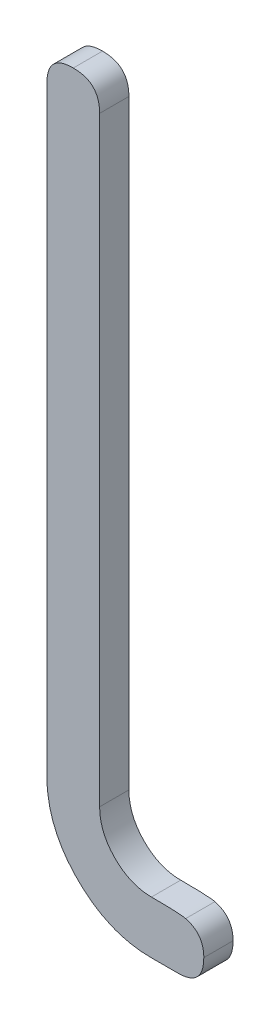
ISO-10303-21;
HEADER;
FILE_DESCRIPTION(('STEP AP214'),'2;1');
FILE_NAME('part.step','',(''),(''),'','','');
FILE_SCHEMA(('AUTOMOTIVE_DESIGN { 1 0 10303 214 1 1 1 1 }'));
ENDSEC;
DATA;
#1=APPLICATION_CONTEXT('core data for automotive mechanical design processes');
#2=APPLICATION_PROTOCOL_DEFINITION('international standard','automotive_design',2000,#1);
#3=PRODUCT_CONTEXT('',#1,'mechanical');
#4=PRODUCT('Part','Part','',(#3));
#5=PRODUCT_RELATED_PRODUCT_CATEGORY('part','',(#4));
#6=PRODUCT_DEFINITION_FORMATION('','',#4);
#7=PRODUCT_DEFINITION_CONTEXT('part definition',#1,'design');
#8=PRODUCT_DEFINITION('design','',#6,#7);
#9=PRODUCT_DEFINITION_SHAPE('','',#8);
#10=(LENGTH_UNIT() NAMED_UNIT(*) SI_UNIT(.MILLI.,.METRE.));
#11=(NAMED_UNIT(*) PLANE_ANGLE_UNIT() SI_UNIT($,.RADIAN.));
#12=(NAMED_UNIT(*) SI_UNIT($,.STERADIAN.) SOLID_ANGLE_UNIT());
#13=UNCERTAINTY_MEASURE_WITH_UNIT(LENGTH_MEASURE(1.E-05),#10,'distance_accuracy_value','');
#14=(GEOMETRIC_REPRESENTATION_CONTEXT(3) GLOBAL_UNCERTAINTY_ASSIGNED_CONTEXT((#13)) GLOBAL_UNIT_ASSIGNED_CONTEXT((#10,
#11,#12)) REPRESENTATION_CONTEXT('',''));
#15=CARTESIAN_POINT('',(0.,0.,0.));
#16=DIRECTION('',(0.,0.,1.));
#17=DIRECTION('',(1.,0.,0.));
#18=AXIS2_PLACEMENT_3D('',#15,#16,#17);
#19=CARTESIAN_POINT('',(0.,0.,1.6));
#20=DIRECTION('',(0.,0.,-1.));
#21=DIRECTION('',(-1.,0.,0.));
#22=AXIS2_PLACEMENT_3D('',#19,#20,#21);
#23=PLANE('',#22);
#24=CARTESIAN_POINT('',(-11.0218187525272,-21.8933047798276,1.6));
#25=CARTESIAN_POINT('',(-11.0134916629387,-21.8933089715033,1.6));
#26=CARTESIAN_POINT('',(-11.0051640767854,-21.8933350682191,1.6));
#27=CARTESIAN_POINT('',(-10.9884968199017,-21.8934723570355,1.6));
#28=CARTESIAN_POINT('',(-10.9801571503607,-21.893583680433,1.6));
#29=CARTESIAN_POINT('',(-10.9662367832498,-21.8938752206733,1.6));
#30=CARTESIAN_POINT('',(-10.9606553838701,-21.8940204983009,1.6));
#31=CARTESIAN_POINT('',(-10.9494994680288,-21.8943951007579,1.6));
#32=CARTESIAN_POINT('',(-10.9439249496041,-21.8946243594988,1.6));
#33=CARTESIAN_POINT('',(-10.9355558994583,-21.8950772269043,1.6));
#34=CARTESIAN_POINT('',(-10.9327585189369,-21.8952468660117,1.6));
#35=CARTESIAN_POINT('',(-10.9271687323597,-21.8956393631298,1.6));
#36=CARTESIAN_POINT('',(-10.9243763245615,-21.8958621955762,1.6));
#37=CARTESIAN_POINT('',(-10.918794114658,-21.8963926595871,1.6));
#38=CARTESIAN_POINT('',(-10.9160043256215,-21.896700438576,1.6));
#39=CARTESIAN_POINT('',(-10.9118333469898,-21.8972860466574,1.6));
#40=CARTESIAN_POINT('',(-10.9104442376156,-21.8975021207957,1.6));
#41=CARTESIAN_POINT('',(-10.9076802076166,-21.8980177596965,1.6));
#42=CARTESIAN_POINT('',(-10.9063053074125,-21.8983174308935,1.6));
#43=CARTESIAN_POINT('',(-10.9049437525278,-21.8986797798274,1.6));
#44=B_SPLINE_CURVE_WITH_KNOTS('',3,(#24,#25,#26,#27,#28,#29,#30,#31,#32,#33,#34,#35,#36,#37,#38,
#39,#40,#41,#42,#43),.UNSPECIFIED.,.F.,.F.,(4,2,2,2,2,2,2,2,2,4),(0.,0.0249820726483614,
0.0500027093461236,0.0667522610148793,0.0834886599236716,0.0918958797264656,0.100299067196362,
0.108716931073482,0.112932378121345,0.117153216906774),.UNSPECIFIED.);
#45=CARTESIAN_POINT('',(-11.0218187525272,-21.8933047798276,1.6));
#46=VERTEX_POINT('',#45);
#47=CARTESIAN_POINT('',(-10.9049437525272,-21.8986797798276,1.6));
#48=VERTEX_POINT('',#47);
#49=EDGE_CURVE('E102',#46,#48,#44,.T.);
#50=ORIENTED_EDGE('',*,*,#49,.T.);
#51=CARTESIAN_POINT('',(-10.9049437525272,-21.8986797798276,1.6));
#52=CARTESIAN_POINT('',(-10.8429437525272,-21.9149297798276,1.6));
#53=CARTESIAN_POINT('',(-10.8429437525272,-21.9833047798276,1.6));
#54=B_SPLINE_CURVE_WITH_KNOTS('',2,(#51,#52,#53),.UNSPECIFIED.,.F.,.F.,(3,3),(0.,1.),.UNSPECIFIED.);
#55=CARTESIAN_POINT('',(-10.8429437525272,-21.9833047798276,1.6));
#56=VERTEX_POINT('',#55);
#57=EDGE_CURVE('E98',#48,#56,#54,.T.);
#58=ORIENTED_EDGE('',*,*,#57,.T.);
#59=CARTESIAN_POINT('',(-10.8429437525272,-21.9833047798276,1.6));
#60=CARTESIAN_POINT('',(-10.8429437525272,-22.0733047798276,1.6));
#61=CARTESIAN_POINT('',(-10.9320062525272,-22.0733047798276,1.6));
#62=B_SPLINE_CURVE_WITH_KNOTS('',2,(#59,#60,#61),.UNSPECIFIED.,.F.,.F.,(3,3),(0.,1.),.UNSPECIFIED.);
#63=CARTESIAN_POINT('',(-10.9320062525272,-22.0733047798276,1.6));
#64=VERTEX_POINT('',#63);
#65=EDGE_CURVE('E99',#56,#64,#62,.T.);
#66=ORIENTED_EDGE('',*,*,#65,.T.);
#67=DIRECTION('',(1.,0.,0.));
#68=VECTOR('',#67,1.);
#69=CARTESIAN_POINT('',(-10.9320062525272,-22.0733047798276,1.6));
#70=LINE('',#69,#68);
#71=CARTESIAN_POINT('',(-11.0228187525272,-22.0733047798276,1.6));
#72=VERTEX_POINT('',#71);
#73=EDGE_CURVE('E105',#72,#64,#70,.T.);
#74=ORIENTED_EDGE('',*,*,#73,.F.);
#75=CARTESIAN_POINT('',(-11.0228187525272,-22.0733047798276,1.6));
#76=CARTESIAN_POINT('',(-11.0397038838066,-22.0733310046813,1.6));
#77=CARTESIAN_POINT('',(-11.056618079808,-22.0722495140739,1.6));
#78=CARTESIAN_POINT('',(-11.090077783474,-22.0677250657179,1.6));
#79=CARTESIAN_POINT('',(-11.1066241373851,-22.0642882719389,1.6));
#80=CARTESIAN_POINT('',(-11.1422858238821,-22.0539612335523,1.6));
#81=CARTESIAN_POINT('',(-11.1612446419249,-22.0465134809615,1.6));
#82=CARTESIAN_POINT('',(-11.1974799831229,-22.0282624769753,1.6));
#83=CARTESIAN_POINT('',(-11.2147546013965,-22.0174554827076,1.6));
#84=CARTESIAN_POINT('',(-11.2461059849784,-21.994000541288,1.6));
#85=CARTESIAN_POINT('',(-11.2603220745942,-21.9815349345195,1.6));
#86=CARTESIAN_POINT('',(-11.2869903288355,-21.9548380963451,1.6));
#87=CARTESIAN_POINT('',(-11.2994420190699,-21.9406063920136,1.6));
#88=CARTESIAN_POINT('',(-11.3241022626189,-21.9075810056475,1.6));
#89=CARTESIAN_POINT('',(-11.3358448913661,-21.8884296956071,1.6));
#90=CARTESIAN_POINT('',(-11.355202011143,-21.8481507712879,1.6));
#91=CARTESIAN_POINT('',(-11.3628213723873,-21.8270255232885,1.6));
#92=CARTESIAN_POINT('',(-11.3719241236683,-21.790822478177,1.6));
#93=CARTESIAN_POINT('',(-11.3745995028068,-21.7760278029041,1.6));
#94=CARTESIAN_POINT('',(-11.378115466613,-21.7462106474557,1.6));
#95=CARTESIAN_POINT('',(-11.3789550738891,-21.7311880502146,1.6));
#96=CARTESIAN_POINT('',(-11.3789437525272,-21.7161797798276,1.6));
#97=B_SPLINE_CURVE_WITH_KNOTS('',3,(#75,#76,#77,#78,#79,#80,#81,#82,#83,#84,#85,#86,#87,#88,#89,
#90,#91,#92,#93,#94,#95,#96),.UNSPECIFIED.,.F.,.F.,(4,2,2,2,2,2,2,2,2,2,4),(0.,
0.0506599501530436,0.101187823942333,0.16192589742171,0.222731889412438,0.279272049884424,
0.335827383489114,0.402784478388054,0.469662313052813,0.514656154349673,0.559673945191779),.UNSPECIFIED.);
#98=CARTESIAN_POINT('',(-11.3789437525272,-21.7161797798276,1.6));
#99=VERTEX_POINT('',#98);
#100=EDGE_CURVE('E151',#72,#99,#97,.T.);
#101=ORIENTED_EDGE('',*,*,#100,.T.);
#102=DIRECTION('',(0.,1.,0.));
#103=VECTOR('',#102,1.);
#104=CARTESIAN_POINT('',(-11.3789437525272,-21.7161797798276,1.6));
#105=LINE('',#104,#103);
#106=CARTESIAN_POINT('',(-11.3789437525272,-19.6626172798276,1.6));
#107=VERTEX_POINT('',#106);
#108=EDGE_CURVE('E188',#107,#99,#105,.F.);
#109=ORIENTED_EDGE('',*,*,#108,.F.);
#110=CARTESIAN_POINT('',(-11.3789437525272,-19.6626172798276,1.6));
#111=CARTESIAN_POINT('',(-11.3789437525272,-19.5733047798276,1.6));
#112=CARTESIAN_POINT('',(-11.2889437525272,-19.5733047798276,1.6));
#113=B_SPLINE_CURVE_WITH_KNOTS('',2,(#110,#111,#112),.UNSPECIFIED.,.F.,.F.,(3,3),(0.,1.),.UNSPECIFIED.);
#114=CARTESIAN_POINT('',(-11.2889437525272,-19.5733047798276,1.6));
#115=VERTEX_POINT('',#114);
#116=EDGE_CURVE('E121',#107,#115,#113,.T.);
#117=ORIENTED_EDGE('',*,*,#116,.T.);
#118=CARTESIAN_POINT('',(-11.2889437525272,-19.5733047798276,1.6));
#119=CARTESIAN_POINT('',(-11.1989437525272,-19.5733047798276,1.6));
#120=CARTESIAN_POINT('',(-11.1989437525272,-19.6625547798276,1.6));
#121=B_SPLINE_CURVE_WITH_KNOTS('',2,(#118,#119,#120),.UNSPECIFIED.,.F.,.F.,(3,3),(0.,1.),.UNSPECIFIED.);
#122=CARTESIAN_POINT('',(-11.1989437525272,-19.6625547798276,1.6));
#123=VERTEX_POINT('',#122);
#124=EDGE_CURVE('E145',#115,#123,#121,.T.);
#125=ORIENTED_EDGE('',*,*,#124,.T.);
#126=DIRECTION('',(0.,1.,0.));
#127=VECTOR('',#126,1.);
#128=CARTESIAN_POINT('',(-11.1989437525272,-19.6625547798276,1.6));
#129=LINE('',#128,#127);
#130=CARTESIAN_POINT('',(-11.1989437525272,-21.7148672798276,1.6));
#131=VERTEX_POINT('',#130);
#132=EDGE_CURVE('E119',#131,#123,#129,.T.);
#133=ORIENTED_EDGE('',*,*,#132,.F.);
#134=CARTESIAN_POINT('',(-11.1989437525272,-21.7148672798276,1.6));
#135=CARTESIAN_POINT('',(-11.1989561849476,-21.723306913579,1.6));
#136=CARTESIAN_POINT('',(-11.1984224311518,-21.7317607263809,1.6));
#137=CARTESIAN_POINT('',(-11.1961878310866,-21.7484891279083,1.6));
#138=CARTESIAN_POINT('',(-11.1944898486032,-21.756764105131,1.6));
#139=CARTESIAN_POINT('',(-11.189352248053,-21.7747201907046,1.6));
#140=CARTESIAN_POINT('',(-11.185615726148,-21.7843190930816,1.6));
#141=CARTESIAN_POINT('',(-11.1764348322275,-21.8026669524549,1.6));
#142=CARTESIAN_POINT('',(-11.1709884778523,-21.811414907374,1.6));
#143=CARTESIAN_POINT('',(-11.1591776849316,-21.8272583991285,1.6));
#144=CARTESIAN_POINT('',(-11.1529108905644,-21.8344282865127,1.6));
#145=CARTESIAN_POINT('',(-11.13947821179,-21.8478716039789,1.6));
#146=CARTESIAN_POINT('',(-11.1323121697682,-21.8541448764945,1.6));
#147=CARTESIAN_POINT('',(-11.1157523143725,-21.8664752272414,1.6));
#148=CARTESIAN_POINT('',(-11.1061873949236,-21.872308832898,1.6));
#149=CARTESIAN_POINT('',(-11.0860680710321,-21.8818892539377,1.6));
#150=CARTESIAN_POINT('',(-11.0755149314253,-21.8856386953423,1.6));
#151=CARTESIAN_POINT('',(-11.0576995249085,-21.8900073907248,1.6));
#152=CARTESIAN_POINT('',(-11.0505841602204,-21.8912636272819,1.6));
#153=CARTESIAN_POINT('',(-11.0362501745737,-21.8929148277432,1.6));
#154=CARTESIAN_POINT('',(-11.029031518826,-21.8933094942486,1.6));
#155=CARTESIAN_POINT('',(-11.0218187525272,-21.8933047798276,1.6));
#156=B_SPLINE_CURVE_WITH_KNOTS('',3,(#134,#135,#136,#137,#138,#139,#140,#141,#142,#143,#144,
#145,#146,#147,#148,#149,#150,#151,#152,#153,#154,#155),.UNSPECIFIED.,.F.,.F.,(4,2,2,2,2,2,2,2,
2,2,4),(0.,0.025321075577972,0.0505800884232037,0.0812933349865772,0.112042322452048,
0.140517994868707,0.168998665317513,0.202386385679847,0.235731942008133,0.257358314031647,
0.278992149920535),.UNSPECIFIED.);
#157=EDGE_CURVE('E23',#131,#46,#156,.T.);
#158=ORIENTED_EDGE('',*,*,#157,.T.);
#159=EDGE_LOOP('',(#50,#58,#66,#74,#101,#109,#117,#125,#133,#158));
#160=FACE_BOUND('',#159,.T.);
#161=ADVANCED_FACE('F17',(#160),#23,.T.);
#162=CARTESIAN_POINT('',(-10.9320062525272,-22.0733047798276,1.7));
#163=DIRECTION('',(0.,-1.,0.));
#164=DIRECTION('',(0.,0.,-1.));
#165=AXIS2_PLACEMENT_3D('',#162,#163,#164);
#166=PLANE('',#165);
#167=DIRECTION('',(-1.,0.,0.));
#168=VECTOR('',#167,1.);
#169=CARTESIAN_POINT('',(0.,-22.0733047798276,1.7));
#170=LINE('',#169,#168);
#171=CARTESIAN_POINT('',(-10.9320062525272,-22.0733047798276,1.7));
#172=VERTEX_POINT('',#171);
#173=CARTESIAN_POINT('',(-11.0228187525272,-22.0733047798276,1.7));
#174=VERTEX_POINT('',#173);
#175=EDGE_CURVE('E110',#172,#174,#170,.T.);
#176=ORIENTED_EDGE('',*,*,#175,.T.);
#177=DIRECTION('',(0.,0.,-1.));
#178=VECTOR('',#177,1.);
#179=CARTESIAN_POINT('',(-11.0228187525272,-22.0733047798276,1.65));
#180=LINE('',#179,#178);
#181=EDGE_CURVE('E262',#174,#72,#180,.T.);
#182=ORIENTED_EDGE('',*,*,#181,.T.);
#183=ORIENTED_EDGE('',*,*,#73,.T.);
#184=DIRECTION('',(0.,0.,1.));
#185=VECTOR('',#184,1.);
#186=CARTESIAN_POINT('',(-10.9320062525272,-22.0733047798276,1.65));
#187=LINE('',#186,#185);
#188=EDGE_CURVE('E111',#64,#172,#187,.T.);
#189=ORIENTED_EDGE('',*,*,#188,.T.);
#190=EDGE_LOOP('',(#176,#182,#183,#189));
#191=FACE_BOUND('',#190,.T.);
#192=ADVANCED_FACE('F133',(#191),#166,.T.);
#193=CARTESIAN_POINT('',(-11.0228187525272,-22.0733047798276,1.7));
#194=CARTESIAN_POINT('',(-11.1688187525272,-22.0733047798276,1.7));
#195=CARTESIAN_POINT('',(-11.3789437525272,-21.8626172798276,1.7));
#196=CARTESIAN_POINT('',(-11.3789437525272,-21.7161797798276,1.7));
#197=CARTESIAN_POINT('',(-11.0228187525272,-22.0733047798276,1.6));
#198=CARTESIAN_POINT('',(-11.1688187525272,-22.0733047798276,1.6));
#199=CARTESIAN_POINT('',(-11.3789437525272,-21.8626172798276,1.6));
#200=CARTESIAN_POINT('',(-11.3789437525272,-21.7161797798276,1.6));
#201=B_SPLINE_SURFACE_WITH_KNOTS('',1,2,((#193,#194,#195,#196),(#197,#198,#199,#200)),
.UNSPECIFIED.,.F.,.F.,.F.,(2,2),(3,1,3),(0.,1.),(0.,0.5,1.),.UNSPECIFIED.);
#202=CARTESIAN_POINT('',(-11.0228187525272,-22.0733047798276,1.7));
#203=CARTESIAN_POINT('',(-11.0397038838066,-22.0733310046813,1.7));
#204=CARTESIAN_POINT('',(-11.056618079808,-22.0722495140739,1.7));
#205=CARTESIAN_POINT('',(-11.090077783474,-22.0677250657179,1.7));
#206=CARTESIAN_POINT('',(-11.1066241373851,-22.0642882719389,1.7));
#207=CARTESIAN_POINT('',(-11.1422858238821,-22.0539612335523,1.7));
#208=CARTESIAN_POINT('',(-11.1612446419249,-22.0465134809615,1.7));
#209=CARTESIAN_POINT('',(-11.1974799831229,-22.0282624769753,1.7));
#210=CARTESIAN_POINT('',(-11.2147546013965,-22.0174554827076,1.7));
#211=CARTESIAN_POINT('',(-11.2461059849784,-21.994000541288,1.7));
#212=CARTESIAN_POINT('',(-11.2603220745942,-21.9815349345195,1.7));
#213=CARTESIAN_POINT('',(-11.2869903288355,-21.9548380963451,1.7));
#214=CARTESIAN_POINT('',(-11.2994420190699,-21.9406063920136,1.7));
#215=CARTESIAN_POINT('',(-11.3241022626189,-21.9075810056475,1.7));
#216=CARTESIAN_POINT('',(-11.3358448913661,-21.8884296956071,1.7));
#217=CARTESIAN_POINT('',(-11.355202011143,-21.8481507712879,1.7));
#218=CARTESIAN_POINT('',(-11.3628213723873,-21.8270255232885,1.7));
#219=CARTESIAN_POINT('',(-11.3719241236683,-21.790822478177,1.7));
#220=CARTESIAN_POINT('',(-11.3745995028068,-21.7760278029041,1.7));
#221=CARTESIAN_POINT('',(-11.378115466613,-21.7462106474557,1.7));
#222=CARTESIAN_POINT('',(-11.3789550738891,-21.7311880502146,1.7));
#223=CARTESIAN_POINT('',(-11.3789437525272,-21.7161797798276,1.7));
#224=B_SPLINE_CURVE_WITH_KNOTS('',3,(#202,#203,#204,#205,#206,#207,#208,#209,#210,#211,#212,
#213,#214,#215,#216,#217,#218,#219,#220,#221,#222,#223),.UNSPECIFIED.,.F.,.F.,(4,2,2,2,2,2,2,2,
2,2,4),(0.,0.0506599501530434,0.101187823942333,0.161925897421711,0.222731889412439,
0.279272049884425,0.335827383489115,0.402784478388055,0.469662313052814,0.514656154349673,
0.559673945191779),.UNSPECIFIED.);
#225=CARTESIAN_POINT('',(-11.3789437525272,-21.7161797798276,1.7));
#226=VERTEX_POINT('',#225);
#227=EDGE_CURVE('E236',#174,#226,#224,.T.);
#228=DIRECTION('',(0.,0.,1.));
#229=VECTOR('',#228,1.);
#230=CARTESIAN_POINT('',(-11.3789437525272,-21.7161797798276,1.7));
#231=LINE('',#230,#229);
#232=EDGE_CURVE('E260',#99,#226,#231,.T.);
#233=ORIENTED_EDGE('',*,*,#181,.F.);
#234=ORIENTED_EDGE('',*,*,#227,.T.);
#235=ORIENTED_EDGE('',*,*,#232,.F.);
#236=ORIENTED_EDGE('',*,*,#100,.F.);
#237=EDGE_LOOP('',(#233,#234,#235,#236));
#238=FACE_BOUND('',#237,.T.);
#239=ADVANCED_FACE('F135',(#238),#201,.F.);
#240=CARTESIAN_POINT('',(-11.3789437525272,-21.7161797798276,1.7));
#241=DIRECTION('',(-1.,0.,0.));
#242=DIRECTION('',(0.,0.,1.));
#243=AXIS2_PLACEMENT_3D('',#240,#241,#242);
#244=PLANE('',#243);
#245=DIRECTION('',(0.,1.,0.));
#246=VECTOR('',#245,1.);
#247=CARTESIAN_POINT('',(-11.3789437525272,0.,1.7));
#248=LINE('',#247,#246);
#249=CARTESIAN_POINT('',(-11.3789437525272,-19.6626172798276,1.7));
#250=VERTEX_POINT('',#249);
#251=EDGE_CURVE('E231',#226,#250,#248,.T.);
#252=ORIENTED_EDGE('',*,*,#251,.T.);
#253=DIRECTION('',(0.,0.,-1.));
#254=VECTOR('',#253,1.);
#255=CARTESIAN_POINT('',(-11.3789437525272,-19.6626172798276,1.65));
#256=LINE('',#255,#254);
#257=EDGE_CURVE('E258',#250,#107,#256,.T.);
#258=ORIENTED_EDGE('',*,*,#257,.T.);
#259=ORIENTED_EDGE('',*,*,#108,.T.);
#260=ORIENTED_EDGE('',*,*,#232,.T.);
#261=EDGE_LOOP('',(#252,#258,#259,#260));
#262=FACE_BOUND('',#261,.T.);
#263=ADVANCED_FACE('F270',(#262),#244,.T.);
#264=CARTESIAN_POINT('',(-11.3789437525272,-19.6626172798276,1.7));
#265=CARTESIAN_POINT('',(-11.3789437525272,-19.5733047798276,1.7));
#266=CARTESIAN_POINT('',(-11.2889437525272,-19.5733047798276,1.7));
#267=CARTESIAN_POINT('',(-11.3789437525272,-19.6626172798276,1.6));
#268=CARTESIAN_POINT('',(-11.3789437525272,-19.5733047798276,1.6));
#269=CARTESIAN_POINT('',(-11.2889437525272,-19.5733047798276,1.6));
#270=B_SPLINE_SURFACE_WITH_KNOTS('',1,2,((#264,#265,#266),(#267,#268,#269)),.UNSPECIFIED.,.F.,
.F.,.F.,(2,2),(3,3),(0.,1.),(0.,1.),.UNSPECIFIED.);
#271=CARTESIAN_POINT('',(-11.3789437525272,-19.6626172798276,1.7));
#272=CARTESIAN_POINT('',(-11.3789437525272,-19.5733047798276,1.7));
#273=CARTESIAN_POINT('',(-11.2889437525272,-19.5733047798276,1.7));
#274=B_SPLINE_CURVE_WITH_KNOTS('',2,(#271,#272,#273),.UNSPECIFIED.,.F.,.F.,(3,3),(0.,1.),.UNSPECIFIED.);
#275=CARTESIAN_POINT('',(-11.2889437525272,-19.5733047798276,1.7));
#276=VERTEX_POINT('',#275);
#277=EDGE_CURVE('E206',#250,#276,#274,.T.);
#278=DIRECTION('',(0.,0.,-1.));
#279=VECTOR('',#278,1.);
#280=CARTESIAN_POINT('',(-11.2889437525272,-19.5733047798276,1.65));
#281=LINE('',#280,#279);
#282=EDGE_CURVE('E256',#276,#115,#281,.T.);
#283=ORIENTED_EDGE('',*,*,#257,.F.);
#284=ORIENTED_EDGE('',*,*,#277,.T.);
#285=ORIENTED_EDGE('',*,*,#282,.T.);
#286=ORIENTED_EDGE('',*,*,#116,.F.);
#287=EDGE_LOOP('',(#283,#284,#285,#286));
#288=FACE_BOUND('',#287,.T.);
#289=ADVANCED_FACE('F274',(#288),#270,.F.);
#290=CARTESIAN_POINT('',(-11.2889437525272,-19.5733047798276,1.7));
#291=CARTESIAN_POINT('',(-11.1989437525272,-19.5733047798276,1.7));
#292=CARTESIAN_POINT('',(-11.1989437525272,-19.6625547798276,1.7));
#293=CARTESIAN_POINT('',(-11.2889437525272,-19.5733047798276,1.6));
#294=CARTESIAN_POINT('',(-11.1989437525272,-19.5733047798276,1.6));
#295=CARTESIAN_POINT('',(-11.1989437525272,-19.6625547798276,1.6));
#296=B_SPLINE_SURFACE_WITH_KNOTS('',1,2,((#290,#291,#292),(#293,#294,#295)),.UNSPECIFIED.,.F.,
.F.,.F.,(2,2),(3,3),(0.,1.),(0.,1.),.UNSPECIFIED.);
#297=CARTESIAN_POINT('',(-11.2889437525272,-19.5733047798276,1.7));
#298=CARTESIAN_POINT('',(-11.1989437525272,-19.5733047798276,1.7));
#299=CARTESIAN_POINT('',(-11.1989437525272,-19.6625547798276,1.7));
#300=B_SPLINE_CURVE_WITH_KNOTS('',2,(#297,#298,#299),.UNSPECIFIED.,.F.,.F.,(3,3),(0.,1.),.UNSPECIFIED.);
#301=CARTESIAN_POINT('',(-11.1989437525272,-19.6625547798276,1.7));
#302=VERTEX_POINT('',#301);
#303=EDGE_CURVE('E210',#276,#302,#300,.T.);
#304=DIRECTION('',(0.,0.,-1.));
#305=VECTOR('',#304,1.);
#306=CARTESIAN_POINT('',(-11.1989437525272,-19.6625547798276,1.7));
#307=LINE('',#306,#305);
#308=EDGE_CURVE('E254',#123,#302,#307,.F.);
#309=ORIENTED_EDGE('',*,*,#282,.F.);
#310=ORIENTED_EDGE('',*,*,#303,.T.);
#311=ORIENTED_EDGE('',*,*,#308,.F.);
#312=ORIENTED_EDGE('',*,*,#124,.F.);
#313=EDGE_LOOP('',(#309,#310,#311,#312));
#314=FACE_BOUND('',#313,.T.);
#315=ADVANCED_FACE('F275',(#314),#296,.F.);
#316=CARTESIAN_POINT('',(-11.1989437525272,-19.6625547798276,1.7));
#317=DIRECTION('',(1.,0.,0.));
#318=DIRECTION('',(0.,0.,-1.));
#319=AXIS2_PLACEMENT_3D('',#316,#317,#318);
#320=PLANE('',#319);
#321=DIRECTION('',(0.,1.,0.));
#322=VECTOR('',#321,1.);
#323=CARTESIAN_POINT('',(-11.1989437525272,0.,1.7));
#324=LINE('',#323,#322);
#325=CARTESIAN_POINT('',(-11.1989437525272,-21.7148672798276,1.7));
#326=VERTEX_POINT('',#325);
#327=EDGE_CURVE('E220',#302,#326,#324,.F.);
#328=ORIENTED_EDGE('',*,*,#327,.T.);
#329=DIRECTION('',(0.,0.,-1.));
#330=VECTOR('',#329,1.);
#331=CARTESIAN_POINT('',(-11.1989437525272,-21.7148672798276,1.65));
#332=LINE('',#331,#330);
#333=EDGE_CURVE('E251',#326,#131,#332,.T.);
#334=ORIENTED_EDGE('',*,*,#333,.T.);
#335=ORIENTED_EDGE('',*,*,#132,.T.);
#336=ORIENTED_EDGE('',*,*,#308,.T.);
#337=EDGE_LOOP('',(#328,#334,#335,#336));
#338=FACE_BOUND('',#337,.T.);
#339=ADVANCED_FACE('F197',(#338),#320,.T.);
#340=CARTESIAN_POINT('',(-11.1989437525272,-21.7148672798276,1.7));
#341=CARTESIAN_POINT('',(-11.1989437525272,-21.7879922798276,1.7));
#342=CARTESIAN_POINT('',(-11.0944437525272,-21.8933047798276,1.7));
#343=CARTESIAN_POINT('',(-11.0218187525272,-21.8933047798276,1.7));
#344=CARTESIAN_POINT('',(-11.1989437525272,-21.7148672798276,1.6));
#345=CARTESIAN_POINT('',(-11.1989437525272,-21.7879922798276,1.6));
#346=CARTESIAN_POINT('',(-11.0944437525272,-21.8933047798276,1.6));
#347=CARTESIAN_POINT('',(-11.0218187525272,-21.8933047798276,1.6));
#348=B_SPLINE_SURFACE_WITH_KNOTS('',1,2,((#340,#341,#342,#343),(#344,#345,#346,#347)),
.UNSPECIFIED.,.F.,.F.,.F.,(2,2),(3,1,3),(0.,1.),(0.,0.5,1.),.UNSPECIFIED.);
#349=CARTESIAN_POINT('',(-11.1989437525272,-21.7148672798276,1.7));
#350=CARTESIAN_POINT('',(-11.1989561849476,-21.723306913579,1.7));
#351=CARTESIAN_POINT('',(-11.1984224311518,-21.7317607263809,1.7));
#352=CARTESIAN_POINT('',(-11.1961878310866,-21.7484891279083,1.7));
#353=CARTESIAN_POINT('',(-11.1944898486032,-21.756764105131,1.7));
#354=CARTESIAN_POINT('',(-11.189352248053,-21.7747201907046,1.7));
#355=CARTESIAN_POINT('',(-11.185615726148,-21.7843190930816,1.7));
#356=CARTESIAN_POINT('',(-11.1764348322275,-21.8026669524549,1.7));
#357=CARTESIAN_POINT('',(-11.1709884778524,-21.811414907374,1.7));
#358=CARTESIAN_POINT('',(-11.1591776849316,-21.8272583991285,1.7));
#359=CARTESIAN_POINT('',(-11.1529108905644,-21.8344282865127,1.7));
#360=CARTESIAN_POINT('',(-11.13947821179,-21.8478716039789,1.7));
#361=CARTESIAN_POINT('',(-11.1323121697682,-21.8541448764945,1.7));
#362=CARTESIAN_POINT('',(-11.1157523143725,-21.8664752272414,1.7));
#363=CARTESIAN_POINT('',(-11.1061873949236,-21.872308832898,1.7));
#364=CARTESIAN_POINT('',(-11.0860680710321,-21.8818892539377,1.7));
#365=CARTESIAN_POINT('',(-11.0755149314253,-21.8856386953423,1.7));
#366=CARTESIAN_POINT('',(-11.0576995249085,-21.8900073907248,1.7));
#367=CARTESIAN_POINT('',(-11.0505841602204,-21.8912636272819,1.7));
#368=CARTESIAN_POINT('',(-11.0362501745737,-21.8929148277432,1.7));
#369=CARTESIAN_POINT('',(-11.029031518826,-21.8933094942486,1.7));
#370=CARTESIAN_POINT('',(-11.0218187525272,-21.8933047798276,1.7));
#371=B_SPLINE_CURVE_WITH_KNOTS('',3,(#349,#350,#351,#352,#353,#354,#355,#356,#357,#358,#359,
#360,#361,#362,#363,#364,#365,#366,#367,#368,#369,#370),.UNSPECIFIED.,.F.,.F.,(4,2,2,2,2,2,2,2,
2,2,4),(0.,0.0253210755779723,0.050580088423203,0.0812933349865785,0.112042322452048,
0.140517994868705,0.168998665317512,0.202386385679846,0.235731942008131,0.257358314031646,
0.278992149920533),.UNSPECIFIED.);
#372=CARTESIAN_POINT('',(-11.0218187525272,-21.8933047798276,1.7));
#373=VERTEX_POINT('',#372);
#374=EDGE_CURVE('E187',#326,#373,#371,.T.);
#375=DIRECTION('',(0.,0.,-1.));
#376=VECTOR('',#375,1.);
#377=CARTESIAN_POINT('',(-11.0218187525272,-21.8933047798276,1.65));
#378=LINE('',#377,#376);
#379=EDGE_CURVE('E248',#373,#46,#378,.T.);
#380=ORIENTED_EDGE('',*,*,#333,.F.);
#381=ORIENTED_EDGE('',*,*,#374,.T.);
#382=ORIENTED_EDGE('',*,*,#379,.T.);
#383=ORIENTED_EDGE('',*,*,#157,.F.);
#384=EDGE_LOOP('',(#380,#381,#382,#383));
#385=FACE_BOUND('',#384,.T.);
#386=ADVANCED_FACE('F165',(#385),#348,.F.);
#387=CARTESIAN_POINT('',(-11.0218187525272,-21.8933047798276,1.7));
#388=CARTESIAN_POINT('',(-10.9244437525272,-21.8933047798276,1.7));
#389=CARTESIAN_POINT('',(-10.9049437525272,-21.8986797798276,1.7));
#390=CARTESIAN_POINT('',(-11.0218187525272,-21.8933047798276,1.6));
#391=CARTESIAN_POINT('',(-10.9244437525272,-21.8933047798276,1.6));
#392=CARTESIAN_POINT('',(-10.9049437525272,-21.8986797798276,1.6));
#393=B_SPLINE_SURFACE_WITH_KNOTS('',1,2,((#387,#388,#389),(#390,#391,#392)),.UNSPECIFIED.,.F.,
.F.,.F.,(2,2),(3,3),(0.,1.),(0.,1.),.UNSPECIFIED.);
#394=CARTESIAN_POINT('',(-11.0218187525272,-21.8933047798276,1.7));
#395=CARTESIAN_POINT('',(-11.0134916629387,-21.8933089715033,1.7));
#396=CARTESIAN_POINT('',(-11.0051640767854,-21.8933350682191,1.7));
#397=CARTESIAN_POINT('',(-10.9884968199017,-21.8934723570355,1.7));
#398=CARTESIAN_POINT('',(-10.9801571503607,-21.893583680433,1.7));
#399=CARTESIAN_POINT('',(-10.9662367832498,-21.8938752206733,1.7));
#400=CARTESIAN_POINT('',(-10.9606553838701,-21.8940204983009,1.7));
#401=CARTESIAN_POINT('',(-10.9494994680288,-21.8943951007579,1.7));
#402=CARTESIAN_POINT('',(-10.9439249496041,-21.8946243594988,1.7));
#403=CARTESIAN_POINT('',(-10.9355558994583,-21.8950772269043,1.7));
#404=CARTESIAN_POINT('',(-10.9327585189369,-21.8952468660117,1.7));
#405=CARTESIAN_POINT('',(-10.9271687323597,-21.8956393631298,1.7));
#406=CARTESIAN_POINT('',(-10.9243763245615,-21.8958621955762,1.7));
#407=CARTESIAN_POINT('',(-10.918794114658,-21.8963926595871,1.7));
#408=CARTESIAN_POINT('',(-10.9160043256215,-21.896700438576,1.7));
#409=CARTESIAN_POINT('',(-10.9118333469898,-21.8972860466574,1.7));
#410=CARTESIAN_POINT('',(-10.9104442376156,-21.8975021207957,1.7));
#411=CARTESIAN_POINT('',(-10.9076802076166,-21.8980177596965,1.7));
#412=CARTESIAN_POINT('',(-10.9063053074125,-21.8983174308935,1.7));
#413=CARTESIAN_POINT('',(-10.9049437525278,-21.8986797798274,1.7));
#414=B_SPLINE_CURVE_WITH_KNOTS('',3,(#394,#395,#396,#397,#398,#399,#400,#401,#402,#403,#404,
#405,#406,#407,#408,#409,#410,#411,#412,#413),.UNSPECIFIED.,.F.,.F.,(4,2,2,2,2,2,2,2,2,4),(0.,
0.0249820726483613,0.0500027093461236,0.0667522610148793,0.0834886599236717,0.0918958797264659,
0.100299067196362,0.108716931073483,0.112932378121345,0.117153216906773),.UNSPECIFIED.);
#415=CARTESIAN_POINT('',(-10.9049437525272,-21.8986797798276,1.7));
#416=VERTEX_POINT('',#415);
#417=EDGE_CURVE('E180',#373,#416,#414,.T.);
#418=DIRECTION('',(0.,0.,-1.));
#419=VECTOR('',#418,1.);
#420=CARTESIAN_POINT('',(-10.9049437525272,-21.8986797798276,1.65));
#421=LINE('',#420,#419);
#422=EDGE_CURVE('E245',#416,#48,#421,.T.);
#423=ORIENTED_EDGE('',*,*,#379,.F.);
#424=ORIENTED_EDGE('',*,*,#417,.T.);
#425=ORIENTED_EDGE('',*,*,#422,.T.);
#426=ORIENTED_EDGE('',*,*,#49,.F.);
#427=EDGE_LOOP('',(#423,#424,#425,#426));
#428=FACE_BOUND('',#427,.T.);
#429=ADVANCED_FACE('F160',(#428),#393,.F.);
#430=CARTESIAN_POINT('',(-10.9049437525272,-21.8986797798276,1.7));
#431=CARTESIAN_POINT('',(-10.8429437525272,-21.9149297798276,1.7));
#432=CARTESIAN_POINT('',(-10.8429437525272,-21.9833047798276,1.7));
#433=CARTESIAN_POINT('',(-10.9049437525272,-21.8986797798276,1.6));
#434=CARTESIAN_POINT('',(-10.8429437525272,-21.9149297798276,1.6));
#435=CARTESIAN_POINT('',(-10.8429437525272,-21.9833047798276,1.6));
#436=B_SPLINE_SURFACE_WITH_KNOTS('',1,2,((#430,#431,#432),(#433,#434,#435)),.UNSPECIFIED.,.F.,
.F.,.F.,(2,2),(3,3),(0.,1.),(0.,1.),.UNSPECIFIED.);
#437=CARTESIAN_POINT('',(-10.9049437525272,-21.8986797798276,1.7));
#438=CARTESIAN_POINT('',(-10.8429437525272,-21.9149297798276,1.7));
#439=CARTESIAN_POINT('',(-10.8429437525272,-21.9833047798276,1.7));
#440=B_SPLINE_CURVE_WITH_KNOTS('',2,(#437,#438,#439),.UNSPECIFIED.,.F.,.F.,(3,3),(0.,1.),.UNSPECIFIED.);
#441=CARTESIAN_POINT('',(-10.8429437525272,-21.9833047798276,1.7));
#442=VERTEX_POINT('',#441);
#443=EDGE_CURVE('E34',#416,#442,#440,.T.);
#444=DIRECTION('',(0.,0.,-1.));
#445=VECTOR('',#444,1.);
#446=CARTESIAN_POINT('',(-10.8429437525272,-21.9833047798276,1.65));
#447=LINE('',#446,#445);
#448=EDGE_CURVE('E42',#442,#56,#447,.T.);
#449=ORIENTED_EDGE('',*,*,#422,.F.);
#450=ORIENTED_EDGE('',*,*,#443,.T.);
#451=ORIENTED_EDGE('',*,*,#448,.T.);
#452=ORIENTED_EDGE('',*,*,#57,.F.);
#453=EDGE_LOOP('',(#449,#450,#451,#452));
#454=FACE_BOUND('',#453,.T.);
#455=ADVANCED_FACE('F108',(#454),#436,.F.);
#456=CARTESIAN_POINT('',(-10.8429437525272,-21.9833047798276,1.7));
#457=CARTESIAN_POINT('',(-10.8429437525272,-22.0733047798276,1.7));
#458=CARTESIAN_POINT('',(-10.9320062525272,-22.0733047798276,1.7));
#459=CARTESIAN_POINT('',(-10.8429437525272,-21.9833047798276,1.6));
#460=CARTESIAN_POINT('',(-10.8429437525272,-22.0733047798276,1.6));
#461=CARTESIAN_POINT('',(-10.9320062525272,-22.0733047798276,1.6));
#462=B_SPLINE_SURFACE_WITH_KNOTS('',1,2,((#456,#457,#458),(#459,#460,#461)),.UNSPECIFIED.,.F.,
.F.,.F.,(2,2),(3,3),(0.,1.),(0.,1.),.UNSPECIFIED.);
#463=CARTESIAN_POINT('',(-10.8429437525272,-21.9833047798276,1.7));
#464=CARTESIAN_POINT('',(-10.8429437525272,-22.0733047798276,1.7));
#465=CARTESIAN_POINT('',(-10.9320062525272,-22.0733047798276,1.7));
#466=B_SPLINE_CURVE_WITH_KNOTS('',2,(#463,#464,#465),.UNSPECIFIED.,.F.,.F.,(3,3),(0.,1.),.UNSPECIFIED.);
#467=EDGE_CURVE('E11',#442,#172,#466,.T.);
#468=ORIENTED_EDGE('',*,*,#448,.F.);
#469=ORIENTED_EDGE('',*,*,#467,.T.);
#470=ORIENTED_EDGE('',*,*,#188,.F.);
#471=ORIENTED_EDGE('',*,*,#65,.F.);
#472=EDGE_LOOP('',(#468,#469,#470,#471));
#473=FACE_BOUND('',#472,.T.);
#474=ADVANCED_FACE('F19',(#473),#462,.F.);
#475=CARTESIAN_POINT('',(0.,0.,1.7));
#476=DIRECTION('',(0.,0.,-1.));
#477=DIRECTION('',(-1.,0.,0.));
#478=AXIS2_PLACEMENT_3D('',#475,#476,#477);
#479=PLANE('',#478);
#480=ORIENTED_EDGE('',*,*,#443,.F.);
#481=ORIENTED_EDGE('',*,*,#417,.F.);
#482=ORIENTED_EDGE('',*,*,#374,.F.);
#483=ORIENTED_EDGE('',*,*,#327,.F.);
#484=ORIENTED_EDGE('',*,*,#303,.F.);
#485=ORIENTED_EDGE('',*,*,#277,.F.);
#486=ORIENTED_EDGE('',*,*,#251,.F.);
#487=ORIENTED_EDGE('',*,*,#227,.F.);
#488=ORIENTED_EDGE('',*,*,#175,.F.);
#489=ORIENTED_EDGE('',*,*,#467,.F.);
#490=EDGE_LOOP('',(#480,#481,#482,#483,#484,#485,#486,#487,#488,#489));
#491=FACE_BOUND('',#490,.T.);
#492=ADVANCED_FACE('F192',(#491),#479,.F.);
#493=CLOSED_SHELL('',(#161,#192,#239,#263,#289,#315,#339,#386,#429,#455,#474,#492));
#494=MANIFOLD_SOLID_BREP('B1',#493);
#495=ADVANCED_BREP_SHAPE_REPRESENTATION('',(#18,#494),#14);
#496=SHAPE_DEFINITION_REPRESENTATION(#9,#495);
ENDSEC;
END-ISO-10303-21;
